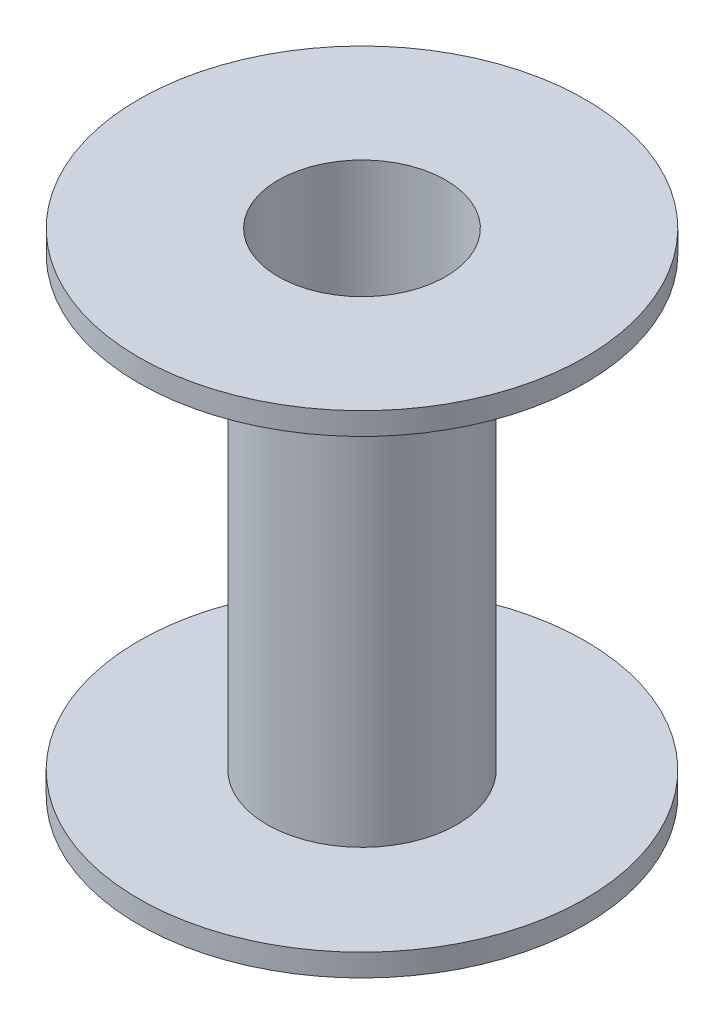
ISO-10303-21;
HEADER;
FILE_DESCRIPTION(('STEP AP214'),'2;1');
FILE_NAME('part.step','',(''),(''),'','','');
FILE_SCHEMA(('AUTOMOTIVE_DESIGN { 1 0 10303 214 1 1 1 1 }'));
ENDSEC;
DATA;
#1=APPLICATION_CONTEXT('core data for automotive mechanical design processes');
#2=APPLICATION_PROTOCOL_DEFINITION('international standard','automotive_design',2000,#1);
#3=PRODUCT_CONTEXT('',#1,'mechanical');
#4=PRODUCT('Part','Part','',(#3));
#5=PRODUCT_RELATED_PRODUCT_CATEGORY('part','',(#4));
#6=PRODUCT_DEFINITION_FORMATION('','',#4);
#7=PRODUCT_DEFINITION_CONTEXT('part definition',#1,'design');
#8=PRODUCT_DEFINITION('design','',#6,#7);
#9=PRODUCT_DEFINITION_SHAPE('','',#8);
#10=(LENGTH_UNIT() NAMED_UNIT(*) SI_UNIT(.MILLI.,.METRE.));
#11=(NAMED_UNIT(*) PLANE_ANGLE_UNIT() SI_UNIT($,.RADIAN.));
#12=(NAMED_UNIT(*) SI_UNIT($,.STERADIAN.) SOLID_ANGLE_UNIT());
#13=UNCERTAINTY_MEASURE_WITH_UNIT(LENGTH_MEASURE(1.E-05),#10,'distance_accuracy_value','');
#14=(GEOMETRIC_REPRESENTATION_CONTEXT(3) GLOBAL_UNCERTAINTY_ASSIGNED_CONTEXT((#13)) GLOBAL_UNIT_ASSIGNED_CONTEXT((#10,
#11,#12)) REPRESENTATION_CONTEXT('',''));
#15=CARTESIAN_POINT('',(0.,0.,0.));
#16=DIRECTION('',(0.,0.,1.));
#17=DIRECTION('',(1.,0.,0.));
#18=AXIS2_PLACEMENT_3D('',#15,#16,#17);
#19=CARTESIAN_POINT('',(0.,20.,0.));
#20=DIRECTION('',(0.,-1.,0.));
#21=DIRECTION('',(0.,0.,-1.));
#22=AXIS2_PLACEMENT_3D('',#19,#20,#21);
#23=CYLINDRICAL_SURFACE('',#22,4.25);
#24=CARTESIAN_POINT('',(0.,20.,0.));
#25=DIRECTION('',(0.,1.,0.));
#26=DIRECTION('',(0.,0.,1.));
#27=AXIS2_PLACEMENT_3D('',#24,#25,#26);
#28=CIRCLE('',#27,4.25);
#29=CARTESIAN_POINT('',(0.,20.,4.25));
#30=VERTEX_POINT('',#29);
#31=EDGE_CURVE('E10',#30,#30,#28,.T.);
#32=ORIENTED_EDGE('',*,*,#31,.F.);
#33=EDGE_LOOP('',(#32));
#34=FACE_BOUND('',#33,.T.);
#35=CARTESIAN_POINT('',(0.,0.,0.));
#36=DIRECTION('',(0.,1.,0.));
#37=DIRECTION('',(0.,0.,1.));
#38=AXIS2_PLACEMENT_3D('',#35,#36,#37);
#39=CIRCLE('',#38,4.25);
#40=CARTESIAN_POINT('',(0.,0.,4.25));
#41=VERTEX_POINT('',#40);
#42=EDGE_CURVE('E48',#41,#41,#39,.T.);
#43=ORIENTED_EDGE('',*,*,#42,.T.);
#44=EDGE_LOOP('',(#43));
#45=FACE_BOUND('',#44,.T.);
#46=ADVANCED_FACE('F45',(#34,#45),#23,.T.);
#47=CARTESIAN_POINT('',(0.,21.,0.));
#48=DIRECTION('',(0.,-1.,0.));
#49=DIRECTION('',(0.,0.,-1.));
#50=AXIS2_PLACEMENT_3D('',#47,#48,#49);
#51=CYLINDRICAL_SURFACE('',#50,10.);
#52=CARTESIAN_POINT('',(0.,21.,0.));
#53=DIRECTION('',(0.,1.,0.));
#54=DIRECTION('',(0.,0.,1.));
#55=AXIS2_PLACEMENT_3D('',#52,#53,#54);
#56=CIRCLE('',#55,10.);
#57=CARTESIAN_POINT('',(0.,21.,10.));
#58=VERTEX_POINT('',#57);
#59=EDGE_CURVE('E53',#58,#58,#56,.T.);
#60=ORIENTED_EDGE('',*,*,#59,.F.);
#61=EDGE_LOOP('',(#60));
#62=FACE_BOUND('',#61,.T.);
#63=CARTESIAN_POINT('',(0.,20.,0.));
#64=DIRECTION('',(0.,1.,0.));
#65=DIRECTION('',(0.,0.,1.));
#66=AXIS2_PLACEMENT_3D('',#63,#64,#65);
#67=CIRCLE('',#66,10.);
#68=CARTESIAN_POINT('',(0.,20.,10.));
#69=VERTEX_POINT('',#68);
#70=EDGE_CURVE('E58',#69,#69,#67,.T.);
#71=ORIENTED_EDGE('',*,*,#70,.T.);
#72=EDGE_LOOP('',(#71));
#73=FACE_BOUND('',#72,.T.);
#74=ADVANCED_FACE('F97',(#62,#73),#51,.T.);
#75=CARTESIAN_POINT('',(0.,21.,0.));
#76=DIRECTION('',(0.,1.,0.));
#77=DIRECTION('',(0.,0.,1.));
#78=AXIS2_PLACEMENT_3D('',#75,#76,#77);
#79=PLANE('',#78);
#80=CARTESIAN_POINT('',(0.,21.,0.));
#81=DIRECTION('',(0.,-1.,0.));
#82=DIRECTION('',(0.,0.,-1.));
#83=AXIS2_PLACEMENT_3D('',#80,#81,#82);
#84=CIRCLE('',#83,3.75);
#85=CARTESIAN_POINT('',(0.,21.,-3.75));
#86=VERTEX_POINT('',#85);
#87=EDGE_CURVE('E69',#86,#86,#84,.T.);
#88=ORIENTED_EDGE('',*,*,#87,.T.);
#89=EDGE_LOOP('',(#88));
#90=FACE_BOUND('',#89,.T.);
#91=ORIENTED_EDGE('',*,*,#59,.T.);
#92=EDGE_LOOP('',(#91));
#93=FACE_BOUND('',#92,.T.);
#94=ADVANCED_FACE('F81',(#90,#93),#79,.T.);
#95=CARTESIAN_POINT('',(0.,20.,0.));
#96=DIRECTION('',(0.,1.,0.));
#97=DIRECTION('',(0.,0.,1.));
#98=AXIS2_PLACEMENT_3D('',#95,#96,#97);
#99=PLANE('',#98);
#100=ORIENTED_EDGE('',*,*,#31,.T.);
#101=EDGE_LOOP('',(#100));
#102=FACE_BOUND('',#101,.T.);
#103=ORIENTED_EDGE('',*,*,#70,.F.);
#104=EDGE_LOOP('',(#103));
#105=FACE_BOUND('',#104,.T.);
#106=ADVANCED_FACE('F112',(#102,#105),#99,.F.);
#107=CARTESIAN_POINT('',(0.,-1.,0.));
#108=DIRECTION('',(0.,1.,0.));
#109=DIRECTION('',(0.,0.,1.));
#110=AXIS2_PLACEMENT_3D('',#107,#108,#109);
#111=CYLINDRICAL_SURFACE('',#110,10.);
#112=CARTESIAN_POINT('',(0.,-1.,0.));
#113=DIRECTION('',(0.,-1.,0.));
#114=DIRECTION('',(0.,0.,-1.));
#115=AXIS2_PLACEMENT_3D('',#112,#113,#114);
#116=CIRCLE('',#115,10.);
#117=CARTESIAN_POINT('',(0.,-1.,-10.));
#118=VERTEX_POINT('',#117);
#119=EDGE_CURVE('E68',#118,#118,#116,.T.);
#120=ORIENTED_EDGE('',*,*,#119,.F.);
#121=EDGE_LOOP('',(#120));
#122=FACE_BOUND('',#121,.T.);
#123=CARTESIAN_POINT('',(0.,0.,0.));
#124=DIRECTION('',(0.,-1.,0.));
#125=DIRECTION('',(0.,0.,-1.));
#126=AXIS2_PLACEMENT_3D('',#123,#124,#125);
#127=CIRCLE('',#126,10.);
#128=CARTESIAN_POINT('',(0.,0.,-10.));
#129=VERTEX_POINT('',#128);
#130=EDGE_CURVE('E64',#129,#129,#127,.T.);
#131=ORIENTED_EDGE('',*,*,#130,.T.);
#132=EDGE_LOOP('',(#131));
#133=FACE_BOUND('',#132,.T.);
#134=ADVANCED_FACE('F110',(#122,#133),#111,.T.);
#135=CARTESIAN_POINT('',(0.,-1.,0.));
#136=DIRECTION('',(0.,-1.,0.));
#137=DIRECTION('',(0.,0.,-1.));
#138=AXIS2_PLACEMENT_3D('',#135,#136,#137);
#139=PLANE('',#138);
#140=CARTESIAN_POINT('',(0.,-1.,0.));
#141=DIRECTION('',(0.,-1.,0.));
#142=DIRECTION('',(0.,0.,-1.));
#143=AXIS2_PLACEMENT_3D('',#140,#141,#142);
#144=CIRCLE('',#143,3.75);
#145=CARTESIAN_POINT('',(0.,-1.,-3.75));
#146=VERTEX_POINT('',#145);
#147=EDGE_CURVE('E73',#146,#146,#144,.T.);
#148=ORIENTED_EDGE('',*,*,#147,.F.);
#149=EDGE_LOOP('',(#148));
#150=FACE_BOUND('',#149,.T.);
#151=ORIENTED_EDGE('',*,*,#119,.T.);
#152=EDGE_LOOP('',(#151));
#153=FACE_BOUND('',#152,.T.);
#154=ADVANCED_FACE('F92',(#150,#153),#139,.T.);
#155=CARTESIAN_POINT('',(0.,0.,0.));
#156=DIRECTION('',(0.,-1.,0.));
#157=DIRECTION('',(0.,0.,-1.));
#158=AXIS2_PLACEMENT_3D('',#155,#156,#157);
#159=PLANE('',#158);
#160=ORIENTED_EDGE('',*,*,#42,.F.);
#161=EDGE_LOOP('',(#160));
#162=FACE_BOUND('',#161,.T.);
#163=ORIENTED_EDGE('',*,*,#130,.F.);
#164=EDGE_LOOP('',(#163));
#165=FACE_BOUND('',#164,.T.);
#166=ADVANCED_FACE('F86',(#162,#165),#159,.F.);
#167=CARTESIAN_POINT('',(0.,20.,0.));
#168=DIRECTION('',(0.,-1.,0.));
#169=DIRECTION('',(0.,0.,-1.));
#170=AXIS2_PLACEMENT_3D('',#167,#168,#169);
#171=CYLINDRICAL_SURFACE('',#170,3.75);
#172=ORIENTED_EDGE('',*,*,#147,.T.);
#173=EDGE_LOOP('',(#172));
#174=FACE_BOUND('',#173,.T.);
#175=ORIENTED_EDGE('',*,*,#87,.F.);
#176=EDGE_LOOP('',(#175));
#177=FACE_BOUND('',#176,.T.);
#178=ADVANCED_FACE('F84',(#174,#177),#171,.F.);
#179=CLOSED_SHELL('',(#46,#74,#94,#106,#134,#154,#166,#178));
#180=MANIFOLD_SOLID_BREP('B2',#179);
#181=ADVANCED_BREP_SHAPE_REPRESENTATION('',(#18,#180),#14);
#182=SHAPE_DEFINITION_REPRESENTATION(#9,#181);
ENDSEC;
END-ISO-10303-21;
